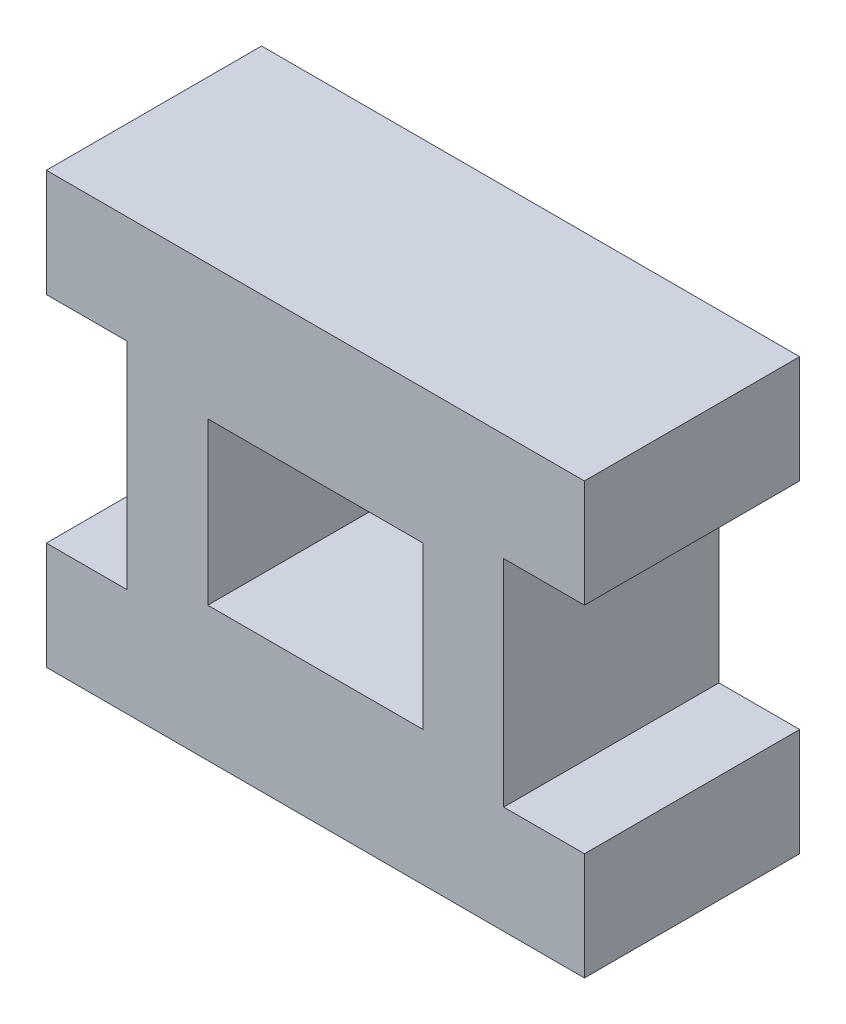
ISO-10303-21;
HEADER;
FILE_DESCRIPTION(('STEP AP214'),'2;1');
FILE_NAME('part.step','',(''),(''),'','','');
FILE_SCHEMA(('AUTOMOTIVE_DESIGN { 1 0 10303 214 1 1 1 1 }'));
ENDSEC;
DATA;
#1=APPLICATION_CONTEXT('core data for automotive mechanical design processes');
#2=APPLICATION_PROTOCOL_DEFINITION('international standard','automotive_design',2000,#1);
#3=PRODUCT_CONTEXT('',#1,'mechanical');
#4=PRODUCT('Part','Part','',(#3));
#5=PRODUCT_RELATED_PRODUCT_CATEGORY('part','',(#4));
#6=PRODUCT_DEFINITION_FORMATION('','',#4);
#7=PRODUCT_DEFINITION_CONTEXT('part definition',#1,'design');
#8=PRODUCT_DEFINITION('design','',#6,#7);
#9=PRODUCT_DEFINITION_SHAPE('','',#8);
#10=(LENGTH_UNIT() NAMED_UNIT(*) SI_UNIT(.MILLI.,.METRE.));
#11=(NAMED_UNIT(*) PLANE_ANGLE_UNIT() SI_UNIT($,.RADIAN.));
#12=(NAMED_UNIT(*) SI_UNIT($,.STERADIAN.) SOLID_ANGLE_UNIT());
#13=UNCERTAINTY_MEASURE_WITH_UNIT(LENGTH_MEASURE(1.E-05),#10,'distance_accuracy_value','');
#14=(GEOMETRIC_REPRESENTATION_CONTEXT(3) GLOBAL_UNCERTAINTY_ASSIGNED_CONTEXT((#13)) GLOBAL_UNIT_ASSIGNED_CONTEXT((#10,
#11,#12)) REPRESENTATION_CONTEXT('',''));
#15=CARTESIAN_POINT('',(0.,0.,0.));
#16=DIRECTION('',(0.,0.,1.));
#17=DIRECTION('',(1.,0.,0.));
#18=AXIS2_PLACEMENT_3D('',#15,#16,#17);
#19=CARTESIAN_POINT('',(0.,0.,40.));
#20=DIRECTION('',(0.,0.,1.));
#21=DIRECTION('',(1.,0.,0.));
#22=AXIS2_PLACEMENT_3D('',#19,#20,#21);
#23=PLANE('',#22);
#24=DIRECTION('',(0.,-1.,0.));
#25=VECTOR('',#24,1.);
#26=CARTESIAN_POINT('',(-34.0412623834325,29.3613822787923,40.));
#27=LINE('',#26,#25);
#28=CARTESIAN_POINT('',(-34.0412623834325,29.3613822787923,40.));
#29=VERTEX_POINT('',#28);
#30=CARTESIAN_POINT('',(-34.0412623834325,9.36138227879234,40.));
#31=VERTEX_POINT('',#30);
#32=EDGE_CURVE('E185',#29,#31,#27,.T.);
#33=ORIENTED_EDGE('',*,*,#32,.T.);
#34=DIRECTION('',(1.,0.,0.));
#35=VECTOR('',#34,1.);
#36=CARTESIAN_POINT('',(-34.0412623834325,9.36138227879234,40.));
#37=LINE('',#36,#35);
#38=CARTESIAN_POINT('',(-19.0412623834325,9.36138227879234,40.));
#39=VERTEX_POINT('',#38);
#40=EDGE_CURVE('E188',#31,#39,#37,.T.);
#41=ORIENTED_EDGE('',*,*,#40,.T.);
#42=DIRECTION('',(0.,-1.,0.));
#43=VECTOR('',#42,1.);
#44=CARTESIAN_POINT('',(-19.0412623834325,9.36138227879234,40.));
#45=LINE('',#44,#43);
#46=CARTESIAN_POINT('',(-19.0412623834325,-30.6386177212077,40.));
#47=VERTEX_POINT('',#46);
#48=EDGE_CURVE('E191',#39,#47,#45,.T.);
#49=ORIENTED_EDGE('',*,*,#48,.T.);
#50=DIRECTION('',(-1.,0.,0.));
#51=VECTOR('',#50,1.);
#52=CARTESIAN_POINT('',(-19.0412623834325,-30.6386177212077,40.));
#53=LINE('',#52,#51);
#54=CARTESIAN_POINT('',(-34.0412623834325,-30.6386177212077,40.));
#55=VERTEX_POINT('',#54);
#56=EDGE_CURVE('E193',#47,#55,#53,.T.);
#57=ORIENTED_EDGE('',*,*,#56,.T.);
#58=DIRECTION('',(0.,-1.,0.));
#59=VECTOR('',#58,1.);
#60=CARTESIAN_POINT('',(-34.0412623834325,-30.6386177212077,40.));
#61=LINE('',#60,#59);
#62=CARTESIAN_POINT('',(-34.0412623834325,-50.6386177212077,40.));
#63=VERTEX_POINT('',#62);
#64=EDGE_CURVE('E195',#55,#63,#61,.T.);
#65=ORIENTED_EDGE('',*,*,#64,.T.);
#66=DIRECTION('',(1.,0.,0.));
#67=VECTOR('',#66,1.);
#68=CARTESIAN_POINT('',(-34.0412623834325,-50.6386177212077,40.));
#69=LINE('',#68,#67);
#70=CARTESIAN_POINT('',(65.9587376165675,-50.6386177212076,40.));
#71=VERTEX_POINT('',#70);
#72=EDGE_CURVE('E197',#63,#71,#69,.T.);
#73=ORIENTED_EDGE('',*,*,#72,.T.);
#74=DIRECTION('',(0.,1.,0.));
#75=VECTOR('',#74,1.);
#76=CARTESIAN_POINT('',(65.9587376165675,-30.6386177212077,40.));
#77=LINE('',#76,#75);
#78=CARTESIAN_POINT('',(65.9587376165675,-30.6386177212077,40.));
#79=VERTEX_POINT('',#78);
#80=EDGE_CURVE('E199',#71,#79,#77,.T.);
#81=ORIENTED_EDGE('',*,*,#80,.T.);
#82=DIRECTION('',(-1.,0.,0.));
#83=VECTOR('',#82,1.);
#84=CARTESIAN_POINT('',(50.9587376165675,-30.6386177212077,40.));
#85=LINE('',#84,#83);
#86=CARTESIAN_POINT('',(50.9587376165675,-30.6386177212077,40.));
#87=VERTEX_POINT('',#86);
#88=EDGE_CURVE('E201',#79,#87,#85,.T.);
#89=ORIENTED_EDGE('',*,*,#88,.T.);
#90=DIRECTION('',(0.,1.,0.));
#91=VECTOR('',#90,1.);
#92=CARTESIAN_POINT('',(50.9587376165675,9.36138227879234,40.));
#93=LINE('',#92,#91);
#94=CARTESIAN_POINT('',(50.9587376165675,9.36138227879234,40.));
#95=VERTEX_POINT('',#94);
#96=EDGE_CURVE('E203',#87,#95,#93,.T.);
#97=ORIENTED_EDGE('',*,*,#96,.T.);
#98=DIRECTION('',(1.,0.,0.));
#99=VECTOR('',#98,1.);
#100=CARTESIAN_POINT('',(65.9587376165675,9.36138227879234,40.));
#101=LINE('',#100,#99);
#102=CARTESIAN_POINT('',(65.9587376165675,9.36138227879234,40.));
#103=VERTEX_POINT('',#102);
#104=EDGE_CURVE('E205',#95,#103,#101,.T.);
#105=ORIENTED_EDGE('',*,*,#104,.T.);
#106=DIRECTION('',(0.,1.,0.));
#107=VECTOR('',#106,1.);
#108=CARTESIAN_POINT('',(65.9587376165675,29.3613822787923,40.));
#109=LINE('',#108,#107);
#110=CARTESIAN_POINT('',(65.9587376165675,29.3613822787923,40.));
#111=VERTEX_POINT('',#110);
#112=EDGE_CURVE('E207',#103,#111,#109,.T.);
#113=ORIENTED_EDGE('',*,*,#112,.T.);
#114=DIRECTION('',(-1.,0.,0.));
#115=VECTOR('',#114,1.);
#116=CARTESIAN_POINT('',(-34.0412623834325,29.3613822787923,40.));
#117=LINE('',#116,#115);
#118=EDGE_CURVE('E209',#111,#29,#117,.T.);
#119=ORIENTED_EDGE('',*,*,#118,.T.);
#120=EDGE_LOOP('',(#33,#41,#49,#57,#65,#73,#81,#89,#97,#105,#113,#119));
#121=FACE_BOUND('',#120,.T.);
#122=DIRECTION('',(0.,-1.,0.));
#123=VECTOR('',#122,1.);
#124=CARTESIAN_POINT('',(-4.04126238343247,4.36138227879234,40.));
#125=LINE('',#124,#123);
#126=CARTESIAN_POINT('',(-4.04126238343247,4.36138227879234,40.));
#127=VERTEX_POINT('',#126);
#128=CARTESIAN_POINT('',(-4.04126238343247,-25.6386177212077,40.));
#129=VERTEX_POINT('',#128);
#130=EDGE_CURVE('E157',#127,#129,#125,.T.);
#131=ORIENTED_EDGE('',*,*,#130,.F.);
#132=DIRECTION('',(-1.,0.,0.));
#133=VECTOR('',#132,1.);
#134=CARTESIAN_POINT('',(-4.04126238343247,4.36138227879234,40.));
#135=LINE('',#134,#133);
#136=CARTESIAN_POINT('',(35.9587376165675,4.36138227879234,40.));
#137=VERTEX_POINT('',#136);
#138=EDGE_CURVE('E149',#137,#127,#135,.T.);
#139=ORIENTED_EDGE('',*,*,#138,.F.);
#140=DIRECTION('',(0.,1.,0.));
#141=VECTOR('',#140,1.);
#142=CARTESIAN_POINT('',(35.9587376165675,4.36138227879234,40.));
#143=LINE('',#142,#141);
#144=CARTESIAN_POINT('',(35.9587376165675,-25.6386177212077,40.));
#145=VERTEX_POINT('',#144);
#146=EDGE_CURVE('E171',#145,#137,#143,.T.);
#147=ORIENTED_EDGE('',*,*,#146,.F.);
#148=DIRECTION('',(1.,0.,0.));
#149=VECTOR('',#148,1.);
#150=CARTESIAN_POINT('',(-4.04126238343247,-25.6386177212077,40.));
#151=LINE('',#150,#149);
#152=EDGE_CURVE('E169',#129,#145,#151,.T.);
#153=ORIENTED_EDGE('',*,*,#152,.F.);
#154=EDGE_LOOP('',(#131,#139,#147,#153));
#155=FACE_BOUND('',#154,.T.);
#156=ADVANCED_FACE('F36',(#121,#155),#23,.T.);
#157=CARTESIAN_POINT('',(0.,0.,0.));
#158=DIRECTION('',(0.,0.,1.));
#159=DIRECTION('',(1.,0.,0.));
#160=AXIS2_PLACEMENT_3D('',#157,#158,#159);
#161=PLANE('',#160);
#162=DIRECTION('',(0.,-1.,0.));
#163=VECTOR('',#162,1.);
#164=CARTESIAN_POINT('',(-34.0412623834325,29.3613822787923,0.));
#165=LINE('',#164,#163);
#166=CARTESIAN_POINT('',(-34.0412623834325,29.3613822787923,0.));
#167=VERTEX_POINT('',#166);
#168=CARTESIAN_POINT('',(-34.0412623834325,9.36138227879234,0.));
#169=VERTEX_POINT('',#168);
#170=EDGE_CURVE('E165',#167,#169,#165,.T.);
#171=ORIENTED_EDGE('',*,*,#170,.F.);
#172=DIRECTION('',(-1.,0.,0.));
#173=VECTOR('',#172,1.);
#174=CARTESIAN_POINT('',(-34.0412623834325,29.3613822787923,0.));
#175=LINE('',#174,#173);
#176=CARTESIAN_POINT('',(65.9587376165675,29.3613822787923,0.));
#177=VERTEX_POINT('',#176);
#178=EDGE_CURVE('E189',#177,#167,#175,.T.);
#179=ORIENTED_EDGE('',*,*,#178,.F.);
#180=DIRECTION('',(0.,1.,0.));
#181=VECTOR('',#180,1.);
#182=CARTESIAN_POINT('',(65.9587376165675,29.3613822787923,0.));
#183=LINE('',#182,#181);
#184=CARTESIAN_POINT('',(65.9587376165675,9.36138227879234,0.));
#185=VERTEX_POINT('',#184);
#186=EDGE_CURVE('E232',#185,#177,#183,.T.);
#187=ORIENTED_EDGE('',*,*,#186,.F.);
#188=DIRECTION('',(1.,0.,0.));
#189=VECTOR('',#188,1.);
#190=CARTESIAN_POINT('',(65.9587376165675,9.36138227879234,0.));
#191=LINE('',#190,#189);
#192=CARTESIAN_POINT('',(50.9587376165675,9.36138227879234,0.));
#193=VERTEX_POINT('',#192);
#194=EDGE_CURVE('E230',#193,#185,#191,.T.);
#195=ORIENTED_EDGE('',*,*,#194,.F.);
#196=DIRECTION('',(0.,1.,0.));
#197=VECTOR('',#196,1.);
#198=CARTESIAN_POINT('',(50.9587376165675,9.36138227879234,0.));
#199=LINE('',#198,#197);
#200=CARTESIAN_POINT('',(50.9587376165675,-30.6386177212077,0.));
#201=VERTEX_POINT('',#200);
#202=EDGE_CURVE('E228',#201,#193,#199,.T.);
#203=ORIENTED_EDGE('',*,*,#202,.F.);
#204=DIRECTION('',(-1.,0.,0.));
#205=VECTOR('',#204,1.);
#206=CARTESIAN_POINT('',(50.9587376165675,-30.6386177212077,0.));
#207=LINE('',#206,#205);
#208=CARTESIAN_POINT('',(65.9587376165675,-30.6386177212077,0.));
#209=VERTEX_POINT('',#208);
#210=EDGE_CURVE('E226',#209,#201,#207,.T.);
#211=ORIENTED_EDGE('',*,*,#210,.F.);
#212=DIRECTION('',(0.,1.,0.));
#213=VECTOR('',#212,1.);
#214=CARTESIAN_POINT('',(65.9587376165675,-30.6386177212077,0.));
#215=LINE('',#214,#213);
#216=CARTESIAN_POINT('',(65.9587376165675,-50.6386177212076,0.));
#217=VERTEX_POINT('',#216);
#218=EDGE_CURVE('E224',#217,#209,#215,.T.);
#219=ORIENTED_EDGE('',*,*,#218,.F.);
#220=DIRECTION('',(1.,0.,0.));
#221=VECTOR('',#220,1.);
#222=CARTESIAN_POINT('',(-34.0412623834325,-50.6386177212077,0.));
#223=LINE('',#222,#221);
#224=CARTESIAN_POINT('',(-34.0412623834325,-50.6386177212077,0.));
#225=VERTEX_POINT('',#224);
#226=EDGE_CURVE('E222',#225,#217,#223,.T.);
#227=ORIENTED_EDGE('',*,*,#226,.F.);
#228=DIRECTION('',(0.,-1.,0.));
#229=VECTOR('',#228,1.);
#230=CARTESIAN_POINT('',(-34.0412623834325,-30.6386177212077,0.));
#231=LINE('',#230,#229);
#232=CARTESIAN_POINT('',(-34.0412623834325,-30.6386177212077,0.));
#233=VERTEX_POINT('',#232);
#234=EDGE_CURVE('E220',#233,#225,#231,.T.);
#235=ORIENTED_EDGE('',*,*,#234,.F.);
#236=DIRECTION('',(-1.,0.,0.));
#237=VECTOR('',#236,1.);
#238=CARTESIAN_POINT('',(-19.0412623834325,-30.6386177212077,0.));
#239=LINE('',#238,#237);
#240=CARTESIAN_POINT('',(-19.0412623834325,-30.6386177212077,0.));
#241=VERTEX_POINT('',#240);
#242=EDGE_CURVE('E218',#241,#233,#239,.T.);
#243=ORIENTED_EDGE('',*,*,#242,.F.);
#244=DIRECTION('',(0.,-1.,0.));
#245=VECTOR('',#244,1.);
#246=CARTESIAN_POINT('',(-19.0412623834325,9.36138227879234,0.));
#247=LINE('',#246,#245);
#248=CARTESIAN_POINT('',(-19.0412623834325,9.36138227879234,0.));
#249=VERTEX_POINT('',#248);
#250=EDGE_CURVE('E216',#249,#241,#247,.T.);
#251=ORIENTED_EDGE('',*,*,#250,.F.);
#252=DIRECTION('',(1.,0.,0.));
#253=VECTOR('',#252,1.);
#254=CARTESIAN_POINT('',(-34.0412623834325,9.36138227879234,0.));
#255=LINE('',#254,#253);
#256=EDGE_CURVE('E214',#169,#249,#255,.T.);
#257=ORIENTED_EDGE('',*,*,#256,.F.);
#258=EDGE_LOOP('',(#171,#179,#187,#195,#203,#211,#219,#227,#235,#243,#251,#257));
#259=FACE_BOUND('',#258,.T.);
#260=DIRECTION('',(-1.,0.,0.));
#261=VECTOR('',#260,1.);
#262=CARTESIAN_POINT('',(-4.04126238343247,4.36138227879234,0.));
#263=LINE('',#262,#261);
#264=CARTESIAN_POINT('',(35.9587376165675,4.36138227879234,0.));
#265=VERTEX_POINT('',#264);
#266=CARTESIAN_POINT('',(-4.04126238343247,4.36138227879234,0.));
#267=VERTEX_POINT('',#266);
#268=EDGE_CURVE('E59',#265,#267,#263,.T.);
#269=ORIENTED_EDGE('',*,*,#268,.T.);
#270=DIRECTION('',(0.,-1.,0.));
#271=VECTOR('',#270,1.);
#272=CARTESIAN_POINT('',(-4.04126238343247,4.36138227879234,0.));
#273=LINE('',#272,#271);
#274=CARTESIAN_POINT('',(-4.04126238343247,-25.6386177212077,0.));
#275=VERTEX_POINT('',#274);
#276=EDGE_CURVE('E164',#267,#275,#273,.T.);
#277=ORIENTED_EDGE('',*,*,#276,.T.);
#278=DIRECTION('',(1.,0.,0.));
#279=VECTOR('',#278,1.);
#280=CARTESIAN_POINT('',(-4.04126238343247,-25.6386177212077,0.));
#281=LINE('',#280,#279);
#282=CARTESIAN_POINT('',(35.9587376165675,-25.6386177212077,0.));
#283=VERTEX_POINT('',#282);
#284=EDGE_CURVE('E177',#275,#283,#281,.T.);
#285=ORIENTED_EDGE('',*,*,#284,.T.);
#286=DIRECTION('',(0.,1.,0.));
#287=VECTOR('',#286,1.);
#288=CARTESIAN_POINT('',(35.9587376165675,4.36138227879234,0.));
#289=LINE('',#288,#287);
#290=EDGE_CURVE('E158',#283,#265,#289,.T.);
#291=ORIENTED_EDGE('',*,*,#290,.T.);
#292=EDGE_LOOP('',(#269,#277,#285,#291));
#293=FACE_BOUND('',#292,.T.);
#294=ADVANCED_FACE('F274',(#259,#293),#161,.F.);
#295=CARTESIAN_POINT('',(-34.0412623834325,29.3613822787923,40.));
#296=DIRECTION('',(1.,0.,0.));
#297=DIRECTION('',(0.,1.,0.));
#298=AXIS2_PLACEMENT_3D('',#295,#296,#297);
#299=PLANE('',#298);
#300=ORIENTED_EDGE('',*,*,#170,.T.);
#301=DIRECTION('',(0.,0.,-1.));
#302=VECTOR('',#301,1.);
#303=CARTESIAN_POINT('',(-34.0412623834325,9.36138227879234,40.));
#304=LINE('',#303,#302);
#305=EDGE_CURVE('E11',#31,#169,#304,.T.);
#306=ORIENTED_EDGE('',*,*,#305,.F.);
#307=ORIENTED_EDGE('',*,*,#32,.F.);
#308=DIRECTION('',(0.,0.,-1.));
#309=VECTOR('',#308,1.);
#310=CARTESIAN_POINT('',(-34.0412623834325,29.3613822787923,40.));
#311=LINE('',#310,#309);
#312=EDGE_CURVE('E211',#29,#167,#311,.T.);
#313=ORIENTED_EDGE('',*,*,#312,.T.);
#314=EDGE_LOOP('',(#300,#306,#307,#313));
#315=FACE_BOUND('',#314,.T.);
#316=ADVANCED_FACE('F38',(#315),#299,.F.);
#317=CARTESIAN_POINT('',(-34.0412623834325,9.36138227879234,40.));
#318=DIRECTION('',(0.,1.,0.));
#319=DIRECTION('',(0.,0.,1.));
#320=AXIS2_PLACEMENT_3D('',#317,#318,#319);
#321=PLANE('',#320);
#322=ORIENTED_EDGE('',*,*,#256,.T.);
#323=DIRECTION('',(0.,0.,-1.));
#324=VECTOR('',#323,1.);
#325=CARTESIAN_POINT('',(-19.0412623834325,9.36138227879234,40.));
#326=LINE('',#325,#324);
#327=EDGE_CURVE('E44',#39,#249,#326,.T.);
#328=ORIENTED_EDGE('',*,*,#327,.F.);
#329=ORIENTED_EDGE('',*,*,#40,.F.);
#330=ORIENTED_EDGE('',*,*,#305,.T.);
#331=EDGE_LOOP('',(#322,#328,#329,#330));
#332=FACE_BOUND('',#331,.T.);
#333=ADVANCED_FACE('F291',(#332),#321,.F.);
#334=CARTESIAN_POINT('',(-19.0412623834325,9.36138227879234,40.));
#335=DIRECTION('',(1.,0.,0.));
#336=DIRECTION('',(0.,1.,0.));
#337=AXIS2_PLACEMENT_3D('',#334,#335,#336);
#338=PLANE('',#337);
#339=ORIENTED_EDGE('',*,*,#250,.T.);
#340=DIRECTION('',(0.,0.,-1.));
#341=VECTOR('',#340,1.);
#342=CARTESIAN_POINT('',(-19.0412623834325,-30.6386177212077,40.));
#343=LINE('',#342,#341);
#344=EDGE_CURVE('E261',#47,#241,#343,.T.);
#345=ORIENTED_EDGE('',*,*,#344,.F.);
#346=ORIENTED_EDGE('',*,*,#48,.F.);
#347=ORIENTED_EDGE('',*,*,#327,.T.);
#348=EDGE_LOOP('',(#339,#345,#346,#347));
#349=FACE_BOUND('',#348,.T.);
#350=ADVANCED_FACE('F268',(#349),#338,.F.);
#351=CARTESIAN_POINT('',(-19.0412623834325,-30.6386177212077,40.));
#352=DIRECTION('',(0.,-1.,0.));
#353=DIRECTION('',(0.,0.,-1.));
#354=AXIS2_PLACEMENT_3D('',#351,#352,#353);
#355=PLANE('',#354);
#356=ORIENTED_EDGE('',*,*,#242,.T.);
#357=DIRECTION('',(0.,0.,-1.));
#358=VECTOR('',#357,1.);
#359=CARTESIAN_POINT('',(-34.0412623834325,-30.6386177212077,40.));
#360=LINE('',#359,#358);
#361=EDGE_CURVE('E258',#55,#233,#360,.T.);
#362=ORIENTED_EDGE('',*,*,#361,.F.);
#363=ORIENTED_EDGE('',*,*,#56,.F.);
#364=ORIENTED_EDGE('',*,*,#344,.T.);
#365=EDGE_LOOP('',(#356,#362,#363,#364));
#366=FACE_BOUND('',#365,.T.);
#367=ADVANCED_FACE('F280',(#366),#355,.F.);
#368=CARTESIAN_POINT('',(-34.0412623834325,-30.6386177212077,40.));
#369=DIRECTION('',(1.,0.,0.));
#370=DIRECTION('',(0.,0.,-1.));
#371=AXIS2_PLACEMENT_3D('',#368,#369,#370);
#372=PLANE('',#371);
#373=ORIENTED_EDGE('',*,*,#234,.T.);
#374=DIRECTION('',(0.,0.,-1.));
#375=VECTOR('',#374,1.);
#376=CARTESIAN_POINT('',(-34.0412623834325,-50.6386177212077,40.));
#377=LINE('',#376,#375);
#378=EDGE_CURVE('E255',#63,#225,#377,.T.);
#379=ORIENTED_EDGE('',*,*,#378,.F.);
#380=ORIENTED_EDGE('',*,*,#64,.F.);
#381=ORIENTED_EDGE('',*,*,#361,.T.);
#382=EDGE_LOOP('',(#373,#379,#380,#381));
#383=FACE_BOUND('',#382,.T.);
#384=ADVANCED_FACE('F284',(#383),#372,.F.);
#385=CARTESIAN_POINT('',(-34.0412623834325,-50.6386177212077,40.));
#386=DIRECTION('',(0.,1.,0.));
#387=DIRECTION('',(-1.,0.,0.));
#388=AXIS2_PLACEMENT_3D('',#385,#386,#387);
#389=PLANE('',#388);
#390=ORIENTED_EDGE('',*,*,#226,.T.);
#391=DIRECTION('',(0.,0.,-1.));
#392=VECTOR('',#391,1.);
#393=CARTESIAN_POINT('',(65.9587376165675,-50.6386177212076,40.));
#394=LINE('',#393,#392);
#395=EDGE_CURVE('E252',#71,#217,#394,.T.);
#396=ORIENTED_EDGE('',*,*,#395,.F.);
#397=ORIENTED_EDGE('',*,*,#72,.F.);
#398=ORIENTED_EDGE('',*,*,#378,.T.);
#399=EDGE_LOOP('',(#390,#396,#397,#398));
#400=FACE_BOUND('',#399,.T.);
#401=ADVANCED_FACE('F324',(#400),#389,.F.);
#402=CARTESIAN_POINT('',(65.9587376165675,-30.6386177212077,40.));
#403=DIRECTION('',(-1.,0.,0.));
#404=DIRECTION('',(0.,0.,1.));
#405=AXIS2_PLACEMENT_3D('',#402,#403,#404);
#406=PLANE('',#405);
#407=ORIENTED_EDGE('',*,*,#218,.T.);
#408=DIRECTION('',(0.,0.,-1.));
#409=VECTOR('',#408,1.);
#410=CARTESIAN_POINT('',(65.9587376165675,-30.6386177212077,40.));
#411=LINE('',#410,#409);
#412=EDGE_CURVE('E249',#79,#209,#411,.T.);
#413=ORIENTED_EDGE('',*,*,#412,.F.);
#414=ORIENTED_EDGE('',*,*,#80,.F.);
#415=ORIENTED_EDGE('',*,*,#395,.T.);
#416=EDGE_LOOP('',(#407,#413,#414,#415));
#417=FACE_BOUND('',#416,.T.);
#418=ADVANCED_FACE('F322',(#417),#406,.F.);
#419=CARTESIAN_POINT('',(50.9587376165675,-30.6386177212077,40.));
#420=DIRECTION('',(0.,-1.,0.));
#421=DIRECTION('',(1.,0.,0.));
#422=AXIS2_PLACEMENT_3D('',#419,#420,#421);
#423=PLANE('',#422);
#424=ORIENTED_EDGE('',*,*,#210,.T.);
#425=DIRECTION('',(0.,0.,-1.));
#426=VECTOR('',#425,1.);
#427=CARTESIAN_POINT('',(50.9587376165675,-30.6386177212077,40.));
#428=LINE('',#427,#426);
#429=EDGE_CURVE('E246',#87,#201,#428,.T.);
#430=ORIENTED_EDGE('',*,*,#429,.F.);
#431=ORIENTED_EDGE('',*,*,#88,.F.);
#432=ORIENTED_EDGE('',*,*,#412,.T.);
#433=EDGE_LOOP('',(#424,#430,#431,#432));
#434=FACE_BOUND('',#433,.T.);
#435=ADVANCED_FACE('F318',(#434),#423,.F.);
#436=CARTESIAN_POINT('',(50.9587376165675,9.36138227879234,40.));
#437=DIRECTION('',(-1.,0.,0.));
#438=DIRECTION('',(0.,0.,1.));
#439=AXIS2_PLACEMENT_3D('',#436,#437,#438);
#440=PLANE('',#439);
#441=ORIENTED_EDGE('',*,*,#202,.T.);
#442=DIRECTION('',(0.,0.,-1.));
#443=VECTOR('',#442,1.);
#444=CARTESIAN_POINT('',(50.9587376165675,9.36138227879234,40.));
#445=LINE('',#444,#443);
#446=EDGE_CURVE('E243',#95,#193,#445,.T.);
#447=ORIENTED_EDGE('',*,*,#446,.F.);
#448=ORIENTED_EDGE('',*,*,#96,.F.);
#449=ORIENTED_EDGE('',*,*,#429,.T.);
#450=EDGE_LOOP('',(#441,#447,#448,#449));
#451=FACE_BOUND('',#450,.T.);
#452=ADVANCED_FACE('F313',(#451),#440,.F.);
#453=CARTESIAN_POINT('',(65.9587376165675,9.36138227879234,40.));
#454=DIRECTION('',(0.,1.,0.));
#455=DIRECTION('',(0.,0.,1.));
#456=AXIS2_PLACEMENT_3D('',#453,#454,#455);
#457=PLANE('',#456);
#458=ORIENTED_EDGE('',*,*,#194,.T.);
#459=DIRECTION('',(0.,0.,-1.));
#460=VECTOR('',#459,1.);
#461=CARTESIAN_POINT('',(65.9587376165675,9.36138227879234,40.));
#462=LINE('',#461,#460);
#463=EDGE_CURVE('E240',#103,#185,#462,.T.);
#464=ORIENTED_EDGE('',*,*,#463,.F.);
#465=ORIENTED_EDGE('',*,*,#104,.F.);
#466=ORIENTED_EDGE('',*,*,#446,.T.);
#467=EDGE_LOOP('',(#458,#464,#465,#466));
#468=FACE_BOUND('',#467,.T.);
#469=ADVANCED_FACE('F307',(#468),#457,.F.);
#470=CARTESIAN_POINT('',(65.9587376165675,29.3613822787923,40.));
#471=DIRECTION('',(-1.,0.,0.));
#472=DIRECTION('',(0.,-1.,0.));
#473=AXIS2_PLACEMENT_3D('',#470,#471,#472);
#474=PLANE('',#473);
#475=ORIENTED_EDGE('',*,*,#186,.T.);
#476=DIRECTION('',(0.,0.,-1.));
#477=VECTOR('',#476,1.);
#478=CARTESIAN_POINT('',(65.9587376165675,29.3613822787923,40.));
#479=LINE('',#478,#477);
#480=EDGE_CURVE('E237',#111,#177,#479,.T.);
#481=ORIENTED_EDGE('',*,*,#480,.F.);
#482=ORIENTED_EDGE('',*,*,#112,.F.);
#483=ORIENTED_EDGE('',*,*,#463,.T.);
#484=EDGE_LOOP('',(#475,#481,#482,#483));
#485=FACE_BOUND('',#484,.T.);
#486=ADVANCED_FACE('F303',(#485),#474,.F.);
#487=CARTESIAN_POINT('',(-34.0412623834325,29.3613822787923,40.));
#488=DIRECTION('',(0.,-1.,0.));
#489=DIRECTION('',(0.,0.,-1.));
#490=AXIS2_PLACEMENT_3D('',#487,#488,#489);
#491=PLANE('',#490);
#492=ORIENTED_EDGE('',*,*,#178,.T.);
#493=ORIENTED_EDGE('',*,*,#312,.F.);
#494=ORIENTED_EDGE('',*,*,#118,.F.);
#495=ORIENTED_EDGE('',*,*,#480,.T.);
#496=EDGE_LOOP('',(#492,#493,#494,#495));
#497=FACE_BOUND('',#496,.T.);
#498=ADVANCED_FACE('F298',(#497),#491,.F.);
#499=CARTESIAN_POINT('',(-4.04126238343247,4.36138227879234,40.));
#500=DIRECTION('',(0.,-1.,0.));
#501=DIRECTION('',(0.,0.,-1.));
#502=AXIS2_PLACEMENT_3D('',#499,#500,#501);
#503=PLANE('',#502);
#504=ORIENTED_EDGE('',*,*,#268,.F.);
#505=DIRECTION('',(0.,0.,-1.));
#506=VECTOR('',#505,1.);
#507=CARTESIAN_POINT('',(35.9587376165675,4.36138227879234,40.));
#508=LINE('',#507,#506);
#509=EDGE_CURVE('E153',#137,#265,#508,.T.);
#510=ORIENTED_EDGE('',*,*,#509,.F.);
#511=ORIENTED_EDGE('',*,*,#138,.T.);
#512=DIRECTION('',(0.,0.,-1.));
#513=VECTOR('',#512,1.);
#514=CARTESIAN_POINT('',(-4.04126238343247,4.36138227879234,40.));
#515=LINE('',#514,#513);
#516=EDGE_CURVE('E152',#127,#267,#515,.T.);
#517=ORIENTED_EDGE('',*,*,#516,.T.);
#518=EDGE_LOOP('',(#504,#510,#511,#517));
#519=FACE_BOUND('',#518,.T.);
#520=ADVANCED_FACE('F151',(#519),#503,.T.);
#521=CARTESIAN_POINT('',(-4.04126238343247,4.36138227879234,40.));
#522=DIRECTION('',(1.,0.,0.));
#523=DIRECTION('',(0.,0.,-1.));
#524=AXIS2_PLACEMENT_3D('',#521,#522,#523);
#525=PLANE('',#524);
#526=ORIENTED_EDGE('',*,*,#276,.F.);
#527=ORIENTED_EDGE('',*,*,#516,.F.);
#528=ORIENTED_EDGE('',*,*,#130,.T.);
#529=DIRECTION('',(0.,0.,-1.));
#530=VECTOR('',#529,1.);
#531=CARTESIAN_POINT('',(-4.04126238343247,-25.6386177212077,40.));
#532=LINE('',#531,#530);
#533=EDGE_CURVE('E166',#129,#275,#532,.T.);
#534=ORIENTED_EDGE('',*,*,#533,.T.);
#535=EDGE_LOOP('',(#526,#527,#528,#534));
#536=FACE_BOUND('',#535,.T.);
#537=ADVANCED_FACE('F161',(#536),#525,.T.);
#538=CARTESIAN_POINT('',(-4.04126238343247,-25.6386177212077,40.));
#539=DIRECTION('',(0.,1.,0.));
#540=DIRECTION('',(0.,0.,1.));
#541=AXIS2_PLACEMENT_3D('',#538,#539,#540);
#542=PLANE('',#541);
#543=ORIENTED_EDGE('',*,*,#284,.F.);
#544=ORIENTED_EDGE('',*,*,#533,.F.);
#545=ORIENTED_EDGE('',*,*,#152,.T.);
#546=DIRECTION('',(0.,0.,-1.));
#547=VECTOR('',#546,1.);
#548=CARTESIAN_POINT('',(35.9587376165675,-25.6386177212077,40.));
#549=LINE('',#548,#547);
#550=EDGE_CURVE('E51',#145,#283,#549,.T.);
#551=ORIENTED_EDGE('',*,*,#550,.T.);
#552=EDGE_LOOP('',(#543,#544,#545,#551));
#553=FACE_BOUND('',#552,.T.);
#554=ADVANCED_FACE('F382',(#553),#542,.T.);
#555=CARTESIAN_POINT('',(35.9587376165675,4.36138227879234,40.));
#556=DIRECTION('',(-1.,0.,0.));
#557=DIRECTION('',(0.,0.,1.));
#558=AXIS2_PLACEMENT_3D('',#555,#556,#557);
#559=PLANE('',#558);
#560=ORIENTED_EDGE('',*,*,#290,.F.);
#561=ORIENTED_EDGE('',*,*,#550,.F.);
#562=ORIENTED_EDGE('',*,*,#146,.T.);
#563=ORIENTED_EDGE('',*,*,#509,.T.);
#564=EDGE_LOOP('',(#560,#561,#562,#563));
#565=FACE_BOUND('',#564,.T.);
#566=ADVANCED_FACE('F388',(#565),#559,.T.);
#567=CLOSED_SHELL('',(#156,#294,#316,#333,#350,#367,#384,#401,#418,#435,#452,#469,#486,#498,
#520,#537,#554,#566));
#568=MANIFOLD_SOLID_BREP('B2',#567);
#569=ADVANCED_BREP_SHAPE_REPRESENTATION('',(#18,#568),#14);
#570=SHAPE_DEFINITION_REPRESENTATION(#9,#569);
ENDSEC;
END-ISO-10303-21;
